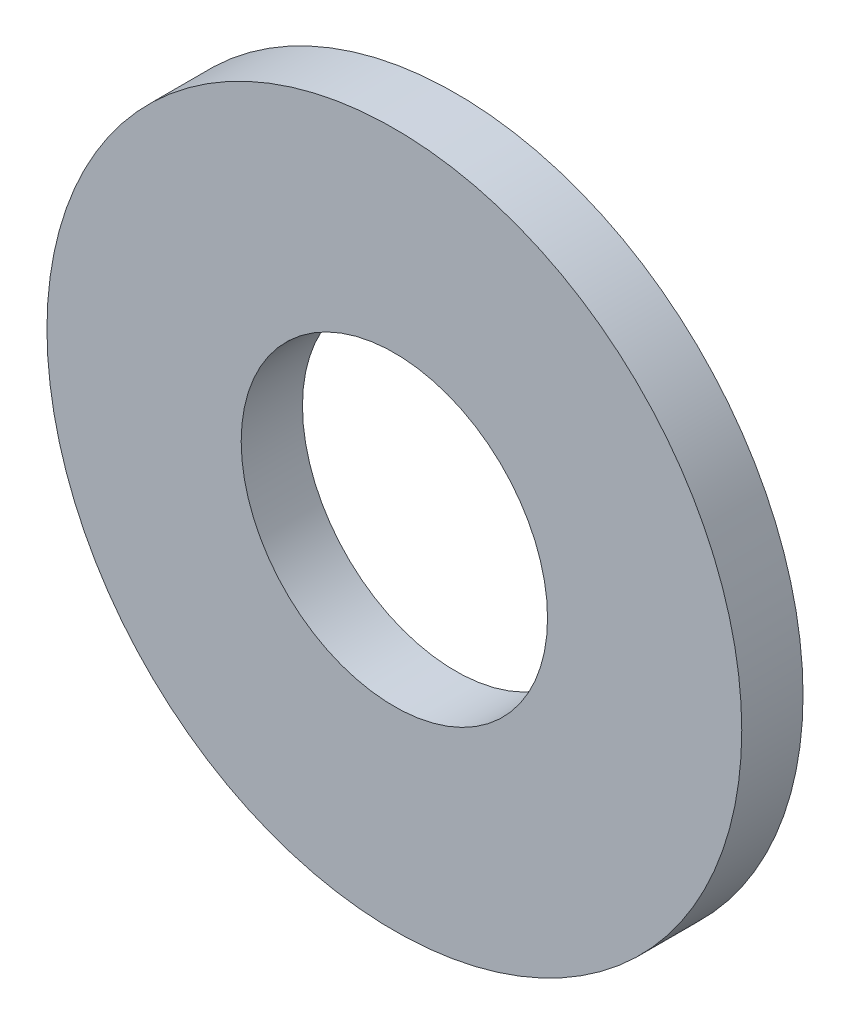
ISO-10303-21;
HEADER;
FILE_DESCRIPTION(('STEP AP214'),'2;1');
FILE_NAME('part.step','',(''),(''),'','','');
FILE_SCHEMA(('AUTOMOTIVE_DESIGN { 1 0 10303 214 1 1 1 1 }'));
ENDSEC;
DATA;
#1=APPLICATION_CONTEXT('core data for automotive mechanical design processes');
#2=APPLICATION_PROTOCOL_DEFINITION('international standard','automotive_design',2000,#1);
#3=PRODUCT_CONTEXT('',#1,'mechanical');
#4=PRODUCT('Part','Part','',(#3));
#5=PRODUCT_RELATED_PRODUCT_CATEGORY('part','',(#4));
#6=PRODUCT_DEFINITION_FORMATION('','',#4);
#7=PRODUCT_DEFINITION_CONTEXT('part definition',#1,'design');
#8=PRODUCT_DEFINITION('design','',#6,#7);
#9=PRODUCT_DEFINITION_SHAPE('','',#8);
#10=(LENGTH_UNIT() NAMED_UNIT(*) SI_UNIT(.MILLI.,.METRE.));
#11=(NAMED_UNIT(*) PLANE_ANGLE_UNIT() SI_UNIT($,.RADIAN.));
#12=(NAMED_UNIT(*) SI_UNIT($,.STERADIAN.) SOLID_ANGLE_UNIT());
#13=UNCERTAINTY_MEASURE_WITH_UNIT(LENGTH_MEASURE(1.E-05),#10,'distance_accuracy_value','');
#14=(GEOMETRIC_REPRESENTATION_CONTEXT(3) GLOBAL_UNCERTAINTY_ASSIGNED_CONTEXT((#13)) GLOBAL_UNIT_ASSIGNED_CONTEXT((#10,
#11,#12)) REPRESENTATION_CONTEXT('',''));
#15=CARTESIAN_POINT('',(0.,0.,0.));
#16=DIRECTION('',(0.,0.,1.));
#17=DIRECTION('',(1.,0.,0.));
#18=AXIS2_PLACEMENT_3D('',#15,#16,#17);
#19=CARTESIAN_POINT('',(0.,0.,1.27));
#20=DIRECTION('',(0.,0.,-1.));
#21=DIRECTION('',(-1.,0.,0.));
#22=AXIS2_PLACEMENT_3D('',#19,#20,#21);
#23=CYLINDRICAL_SURFACE('',#22,7.2009);
#24=CARTESIAN_POINT('',(0.,0.,1.27));
#25=DIRECTION('',(0.,0.,1.));
#26=DIRECTION('',(1.,0.,0.));
#27=AXIS2_PLACEMENT_3D('',#24,#25,#26);
#28=CIRCLE('',#27,7.2009);
#29=CARTESIAN_POINT('',(7.2009,0.,1.27));
#30=VERTEX_POINT('',#29);
#31=EDGE_CURVE('E10',#30,#30,#28,.T.);
#32=ORIENTED_EDGE('',*,*,#31,.F.);
#33=EDGE_LOOP('',(#32));
#34=FACE_BOUND('',#33,.T.);
#35=CARTESIAN_POINT('',(0.,0.,0.));
#36=DIRECTION('',(0.,0.,1.));
#37=DIRECTION('',(1.,0.,0.));
#38=AXIS2_PLACEMENT_3D('',#35,#36,#37);
#39=CIRCLE('',#38,7.2009);
#40=CARTESIAN_POINT('',(7.2009,0.,0.));
#41=VERTEX_POINT('',#40);
#42=EDGE_CURVE('E44',#41,#41,#39,.T.);
#43=ORIENTED_EDGE('',*,*,#42,.T.);
#44=EDGE_LOOP('',(#43));
#45=FACE_BOUND('',#44,.T.);
#46=ADVANCED_FACE('F41',(#34,#45),#23,.T.);
#47=CARTESIAN_POINT('',(0.,0.,1.27));
#48=DIRECTION('',(0.,0.,1.));
#49=DIRECTION('',(1.,0.,0.));
#50=AXIS2_PLACEMENT_3D('',#47,#48,#49);
#51=PLANE('',#50);
#52=CARTESIAN_POINT('',(0.,0.,1.27));
#53=DIRECTION('',(0.,0.,1.));
#54=DIRECTION('',(1.,0.,0.));
#55=AXIS2_PLACEMENT_3D('',#52,#53,#54);
#56=CIRCLE('',#55,3.175);
#57=CARTESIAN_POINT('',(3.175,0.,1.27));
#58=VERTEX_POINT('',#57);
#59=EDGE_CURVE('E55',#58,#58,#56,.T.);
#60=ORIENTED_EDGE('',*,*,#59,.F.);
#61=EDGE_LOOP('',(#60));
#62=FACE_BOUND('',#61,.T.);
#63=ORIENTED_EDGE('',*,*,#31,.T.);
#64=EDGE_LOOP('',(#63));
#65=FACE_BOUND('',#64,.T.);
#66=ADVANCED_FACE('F72',(#62,#65),#51,.T.);
#67=CARTESIAN_POINT('',(0.,0.,0.));
#68=DIRECTION('',(0.,0.,1.));
#69=DIRECTION('',(1.,0.,0.));
#70=AXIS2_PLACEMENT_3D('',#67,#68,#69);
#71=PLANE('',#70);
#72=CARTESIAN_POINT('',(0.,0.,0.));
#73=DIRECTION('',(0.,0.,1.));
#74=DIRECTION('',(1.,0.,0.));
#75=AXIS2_PLACEMENT_3D('',#72,#73,#74);
#76=CIRCLE('',#75,3.175);
#77=CARTESIAN_POINT('',(3.175,0.,0.));
#78=VERTEX_POINT('',#77);
#79=EDGE_CURVE('E53',#78,#78,#76,.T.);
#80=ORIENTED_EDGE('',*,*,#79,.T.);
#81=EDGE_LOOP('',(#80));
#82=FACE_BOUND('',#81,.T.);
#83=ORIENTED_EDGE('',*,*,#42,.F.);
#84=EDGE_LOOP('',(#83));
#85=FACE_BOUND('',#84,.T.);
#86=ADVANCED_FACE('F63',(#82,#85),#71,.F.);
#87=CARTESIAN_POINT('',(0.,0.,0.));
#88=DIRECTION('',(0.,0.,1.));
#89=DIRECTION('',(1.,0.,0.));
#90=AXIS2_PLACEMENT_3D('',#87,#88,#89);
#91=CYLINDRICAL_SURFACE('',#90,3.175);
#92=ORIENTED_EDGE('',*,*,#79,.F.);
#93=EDGE_LOOP('',(#92));
#94=FACE_BOUND('',#93,.T.);
#95=ORIENTED_EDGE('',*,*,#59,.T.);
#96=EDGE_LOOP('',(#95));
#97=FACE_BOUND('',#96,.T.);
#98=ADVANCED_FACE('F66',(#94,#97),#91,.F.);
#99=CLOSED_SHELL('',(#46,#66,#86,#98));
#100=MANIFOLD_SOLID_BREP('B2',#99);
#101=ADVANCED_BREP_SHAPE_REPRESENTATION('',(#18,#100),#14);
#102=SHAPE_DEFINITION_REPRESENTATION(#9,#101);
ENDSEC;
END-ISO-10303-21;
